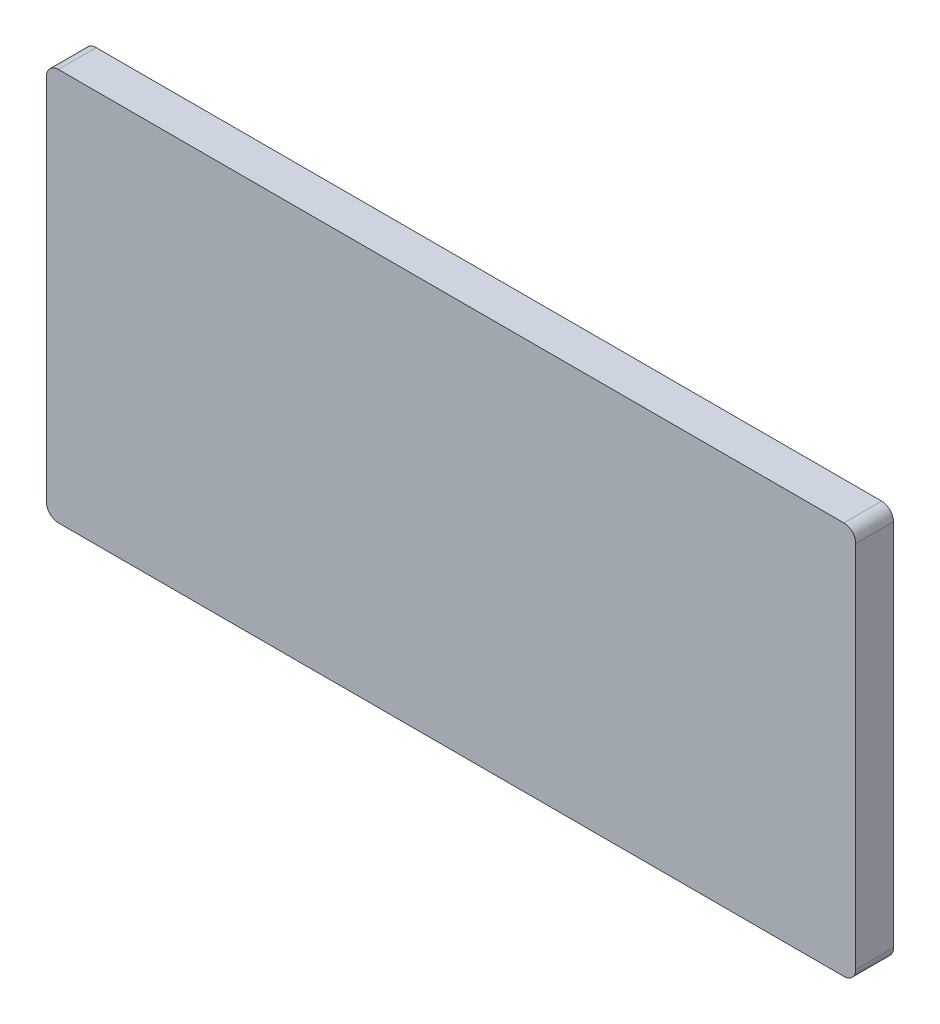
ISO-10303-21;
HEADER;
FILE_DESCRIPTION(('STEP AP214'),'2;1');
FILE_NAME('part.step','',(''),(''),'','','');
FILE_SCHEMA(('AUTOMOTIVE_DESIGN { 1 0 10303 214 1 1 1 1 }'));
ENDSEC;
DATA;
#1=APPLICATION_CONTEXT('core data for automotive mechanical design processes');
#2=APPLICATION_PROTOCOL_DEFINITION('international standard','automotive_design',2000,#1);
#3=PRODUCT_CONTEXT('',#1,'mechanical');
#4=PRODUCT('Part','Part','',(#3));
#5=PRODUCT_RELATED_PRODUCT_CATEGORY('part','',(#4));
#6=PRODUCT_DEFINITION_FORMATION('','',#4);
#7=PRODUCT_DEFINITION_CONTEXT('part definition',#1,'design');
#8=PRODUCT_DEFINITION('design','',#6,#7);
#9=PRODUCT_DEFINITION_SHAPE('','',#8);
#10=(LENGTH_UNIT() NAMED_UNIT(*) SI_UNIT(.MILLI.,.METRE.));
#11=(NAMED_UNIT(*) PLANE_ANGLE_UNIT() SI_UNIT($,.RADIAN.));
#12=(NAMED_UNIT(*) SI_UNIT($,.STERADIAN.) SOLID_ANGLE_UNIT());
#13=UNCERTAINTY_MEASURE_WITH_UNIT(LENGTH_MEASURE(1.E-05),#10,'distance_accuracy_value','');
#14=(GEOMETRIC_REPRESENTATION_CONTEXT(3) GLOBAL_UNCERTAINTY_ASSIGNED_CONTEXT((#13)) GLOBAL_UNIT_ASSIGNED_CONTEXT((#10,
#11,#12)) REPRESENTATION_CONTEXT('',''));
#15=CARTESIAN_POINT('',(0.,0.,0.));
#16=DIRECTION('',(0.,0.,1.));
#17=DIRECTION('',(1.,0.,0.));
#18=AXIS2_PLACEMENT_3D('',#15,#16,#17);
#19=CARTESIAN_POINT('',(0.,16.5,3.175));
#20=DIRECTION('',(0.,-1.,0.));
#21=DIRECTION('',(1.,0.,0.));
#22=AXIS2_PLACEMENT_3D('',#19,#20,#21);
#23=PLANE('',#22);
#24=DIRECTION('',(-1.,0.,0.));
#25=VECTOR('',#24,1.);
#26=CARTESIAN_POINT('',(0.,16.5,0.));
#27=LINE('',#26,#25);
#28=CARTESIAN_POINT('',(33.,16.5,0.));
#29=VERTEX_POINT('',#28);
#30=CARTESIAN_POINT('',(-33.,16.5,0.));
#31=VERTEX_POINT('',#30);
#32=EDGE_CURVE('E366',#29,#31,#27,.T.);
#33=ORIENTED_EDGE('',*,*,#32,.T.);
#34=DIRECTION('',(0.,0.,-1.));
#35=VECTOR('',#34,1.);
#36=CARTESIAN_POINT('',(-33.,16.5,3.175));
#37=LINE('',#36,#35);
#38=CARTESIAN_POINT('',(-33.,16.5,3.175));
#39=VERTEX_POINT('',#38);
#40=EDGE_CURVE('E11',#31,#39,#37,.F.);
#41=ORIENTED_EDGE('',*,*,#40,.T.);
#42=DIRECTION('',(-1.,0.,0.));
#43=VECTOR('',#42,1.);
#44=CARTESIAN_POINT('',(0.,16.5,3.175));
#45=LINE('',#44,#43);
#46=CARTESIAN_POINT('',(33.,16.5,3.175));
#47=VERTEX_POINT('',#46);
#48=EDGE_CURVE('E369',#47,#39,#45,.T.);
#49=ORIENTED_EDGE('',*,*,#48,.F.);
#50=DIRECTION('',(0.,0.,-1.));
#51=VECTOR('',#50,1.);
#52=CARTESIAN_POINT('',(33.,16.5,0.));
#53=LINE('',#52,#51);
#54=EDGE_CURVE('E52',#47,#29,#53,.T.);
#55=ORIENTED_EDGE('',*,*,#54,.T.);
#56=EDGE_LOOP('',(#33,#41,#49,#55));
#57=FACE_BOUND('',#56,.T.);
#58=ADVANCED_FACE('F44',(#57),#23,.F.);
#59=CARTESIAN_POINT('',(-34.,0.,3.175));
#60=DIRECTION('',(1.,0.,0.));
#61=DIRECTION('',(0.,0.,-1.));
#62=AXIS2_PLACEMENT_3D('',#59,#60,#61);
#63=PLANE('',#62);
#64=DIRECTION('',(0.,-1.,0.));
#65=VECTOR('',#64,1.);
#66=CARTESIAN_POINT('',(-34.,0.,0.));
#67=LINE('',#66,#65);
#68=CARTESIAN_POINT('',(-34.,15.5,0.));
#69=VERTEX_POINT('',#68);
#70=CARTESIAN_POINT('',(-34.,-15.5,0.));
#71=VERTEX_POINT('',#70);
#72=EDGE_CURVE('E389',#69,#71,#67,.T.);
#73=ORIENTED_EDGE('',*,*,#72,.T.);
#74=DIRECTION('',(0.,0.,-1.));
#75=VECTOR('',#74,1.);
#76=CARTESIAN_POINT('',(-34.,-15.5,3.175));
#77=LINE('',#76,#75);
#78=CARTESIAN_POINT('',(-34.,-15.5,3.175));
#79=VERTEX_POINT('',#78);
#80=EDGE_CURVE('E434',#71,#79,#77,.F.);
#81=ORIENTED_EDGE('',*,*,#80,.T.);
#82=DIRECTION('',(0.,-1.,0.));
#83=VECTOR('',#82,1.);
#84=CARTESIAN_POINT('',(-34.,0.,3.175));
#85=LINE('',#84,#83);
#86=CARTESIAN_POINT('',(-34.,15.5,3.175));
#87=VERTEX_POINT('',#86);
#88=EDGE_CURVE('E373',#87,#79,#85,.T.);
#89=ORIENTED_EDGE('',*,*,#88,.F.);
#90=DIRECTION('',(0.,0.,-1.));
#91=VECTOR('',#90,1.);
#92=CARTESIAN_POINT('',(-34.,15.5,3.175));
#93=LINE('',#92,#91);
#94=EDGE_CURVE('E431',#87,#69,#93,.T.);
#95=ORIENTED_EDGE('',*,*,#94,.T.);
#96=EDGE_LOOP('',(#73,#81,#89,#95));
#97=FACE_BOUND('',#96,.T.);
#98=ADVANCED_FACE('F454',(#97),#63,.F.);
#99=CARTESIAN_POINT('',(0.,-16.5,3.175));
#100=DIRECTION('',(0.,-1.,0.));
#101=DIRECTION('',(1.,0.,0.));
#102=AXIS2_PLACEMENT_3D('',#99,#100,#101);
#103=PLANE('',#102);
#104=DIRECTION('',(-1.,0.,0.));
#105=VECTOR('',#104,1.);
#106=CARTESIAN_POINT('',(0.,-16.5,0.));
#107=LINE('',#106,#105);
#108=CARTESIAN_POINT('',(33.,-16.5,0.));
#109=VERTEX_POINT('',#108);
#110=CARTESIAN_POINT('',(-33.,-16.5,0.));
#111=VERTEX_POINT('',#110);
#112=EDGE_CURVE('E392',#109,#111,#107,.T.);
#113=ORIENTED_EDGE('',*,*,#112,.F.);
#114=DIRECTION('',(0.,0.,-1.));
#115=VECTOR('',#114,1.);
#116=CARTESIAN_POINT('',(33.,-16.5,3.175));
#117=LINE('',#116,#115);
#118=CARTESIAN_POINT('',(33.,-16.5,3.175));
#119=VERTEX_POINT('',#118);
#120=EDGE_CURVE('E418',#109,#119,#117,.F.);
#121=ORIENTED_EDGE('',*,*,#120,.T.);
#122=DIRECTION('',(-1.,0.,0.));
#123=VECTOR('',#122,1.);
#124=CARTESIAN_POINT('',(0.,-16.5,3.175));
#125=LINE('',#124,#123);
#126=CARTESIAN_POINT('',(-33.,-16.5,3.175));
#127=VERTEX_POINT('',#126);
#128=EDGE_CURVE('E377',#119,#127,#125,.T.);
#129=ORIENTED_EDGE('',*,*,#128,.T.);
#130=DIRECTION('',(0.,0.,-1.));
#131=VECTOR('',#130,1.);
#132=CARTESIAN_POINT('',(-33.,-16.5,0.));
#133=LINE('',#132,#131);
#134=EDGE_CURVE('E415',#127,#111,#133,.T.);
#135=ORIENTED_EDGE('',*,*,#134,.T.);
#136=EDGE_LOOP('',(#113,#121,#129,#135));
#137=FACE_BOUND('',#136,.T.);
#138=ADVANCED_FACE('F465',(#137),#103,.T.);
#139=CARTESIAN_POINT('',(34.,0.,3.175));
#140=DIRECTION('',(1.,0.,0.));
#141=DIRECTION('',(0.,1.,0.));
#142=AXIS2_PLACEMENT_3D('',#139,#140,#141);
#143=PLANE('',#142);
#144=DIRECTION('',(0.,-1.,0.));
#145=VECTOR('',#144,1.);
#146=CARTESIAN_POINT('',(34.,0.,3.175));
#147=LINE('',#146,#145);
#148=CARTESIAN_POINT('',(34.,15.5,3.175));
#149=VERTEX_POINT('',#148);
#150=CARTESIAN_POINT('',(34.,-15.5,3.175));
#151=VERTEX_POINT('',#150);
#152=EDGE_CURVE('E381',#149,#151,#147,.T.);
#153=ORIENTED_EDGE('',*,*,#152,.T.);
#154=DIRECTION('',(0.,0.,-1.));
#155=VECTOR('',#154,1.);
#156=CARTESIAN_POINT('',(34.,-15.5,3.175));
#157=LINE('',#156,#155);
#158=CARTESIAN_POINT('',(34.,-15.5,0.));
#159=VERTEX_POINT('',#158);
#160=EDGE_CURVE('E401',#151,#159,#157,.T.);
#161=ORIENTED_EDGE('',*,*,#160,.T.);
#162=DIRECTION('',(0.,-1.,0.));
#163=VECTOR('',#162,1.);
#164=CARTESIAN_POINT('',(34.,0.,0.));
#165=LINE('',#164,#163);
#166=CARTESIAN_POINT('',(34.,15.5,0.));
#167=VERTEX_POINT('',#166);
#168=EDGE_CURVE('E374',#167,#159,#165,.T.);
#169=ORIENTED_EDGE('',*,*,#168,.F.);
#170=DIRECTION('',(0.,0.,-1.));
#171=VECTOR('',#170,1.);
#172=CARTESIAN_POINT('',(34.,15.5,3.175));
#173=LINE('',#172,#171);
#174=EDGE_CURVE('E385',#167,#149,#173,.F.);
#175=ORIENTED_EDGE('',*,*,#174,.T.);
#176=EDGE_LOOP('',(#153,#161,#169,#175));
#177=FACE_BOUND('',#176,.T.);
#178=ADVANCED_FACE('F472',(#177),#143,.T.);
#179=CARTESIAN_POINT('',(0.,0.,3.175));
#180=DIRECTION('',(0.,0.,1.));
#181=DIRECTION('',(1.,0.,0.));
#182=AXIS2_PLACEMENT_3D('',#179,#180,#181);
#183=PLANE('',#182);
#184=ORIENTED_EDGE('',*,*,#128,.F.);
#185=CARTESIAN_POINT('',(33.,-15.5,3.175));
#186=DIRECTION('',(0.,0.,1.));
#187=DIRECTION('',(1.,0.,0.));
#188=AXIS2_PLACEMENT_3D('',#185,#186,#187);
#189=CIRCLE('',#188,1.);
#190=EDGE_CURVE('E428',#119,#151,#189,.T.);
#191=ORIENTED_EDGE('',*,*,#190,.T.);
#192=ORIENTED_EDGE('',*,*,#152,.F.);
#193=CARTESIAN_POINT('',(33.,15.5,3.175));
#194=DIRECTION('',(0.,0.,1.));
#195=DIRECTION('',(1.,0.,0.));
#196=AXIS2_PLACEMENT_3D('',#193,#194,#195);
#197=CIRCLE('',#196,1.);
#198=EDGE_CURVE('E421',#149,#47,#197,.T.);
#199=ORIENTED_EDGE('',*,*,#198,.T.);
#200=ORIENTED_EDGE('',*,*,#48,.T.);
#201=CARTESIAN_POINT('',(-33.,15.5,3.175));
#202=DIRECTION('',(0.,0.,1.));
#203=DIRECTION('',(1.,0.,0.));
#204=AXIS2_PLACEMENT_3D('',#201,#202,#203);
#205=CIRCLE('',#204,1.);
#206=EDGE_CURVE('E424',#39,#87,#205,.T.);
#207=ORIENTED_EDGE('',*,*,#206,.T.);
#208=ORIENTED_EDGE('',*,*,#88,.T.);
#209=CARTESIAN_POINT('',(-33.,-15.5,3.175));
#210=DIRECTION('',(0.,0.,1.));
#211=DIRECTION('',(1.,0.,0.));
#212=AXIS2_PLACEMENT_3D('',#209,#210,#211);
#213=CIRCLE('',#212,1.);
#214=EDGE_CURVE('E426',#79,#127,#213,.T.);
#215=ORIENTED_EDGE('',*,*,#214,.T.);
#216=EDGE_LOOP('',(#184,#191,#192,#199,#200,#207,#208,#215));
#217=FACE_BOUND('',#216,.T.);
#218=ADVANCED_FACE('F459',(#217),#183,.T.);
#219=CARTESIAN_POINT('',(0.,0.,0.));
#220=DIRECTION('',(0.,0.,1.));
#221=DIRECTION('',(1.,0.,0.));
#222=AXIS2_PLACEMENT_3D('',#219,#220,#221);
#223=PLANE('',#222);
#224=CARTESIAN_POINT('',(-31.75,-14.25,0.));
#225=DIRECTION('',(0.,0.,-1.));
#226=DIRECTION('',(-1.,0.,0.));
#227=AXIS2_PLACEMENT_3D('',#224,#225,#226);
#228=CIRCLE('',#227,1.7);
#229=CARTESIAN_POINT('',(-33.45,-14.25,0.));
#230=VERTEX_POINT('',#229);
#231=EDGE_CURVE('E270',#230,#230,#228,.T.);
#232=ORIENTED_EDGE('',*,*,#231,.F.);
#233=EDGE_LOOP('',(#232));
#234=FACE_BOUND('',#233,.T.);
#235=CARTESIAN_POINT('',(-31.75,14.25,0.));
#236=DIRECTION('',(0.,0.,-1.));
#237=DIRECTION('',(1.,0.,0.));
#238=AXIS2_PLACEMENT_3D('',#235,#236,#237);
#239=CIRCLE('',#238,1.7);
#240=CARTESIAN_POINT('',(-30.05,14.25,0.));
#241=VERTEX_POINT('',#240);
#242=EDGE_CURVE('E276',#241,#241,#239,.T.);
#243=ORIENTED_EDGE('',*,*,#242,.F.);
#244=EDGE_LOOP('',(#243));
#245=FACE_BOUND('',#244,.T.);
#246=DIRECTION('',(-1.,0.,0.));
#247=VECTOR('',#246,1.);
#248=CARTESIAN_POINT('',(31.75,12.55,0.));
#249=LINE('',#248,#247);
#250=CARTESIAN_POINT('',(31.75,12.55,0.));
#251=VERTEX_POINT('',#250);
#252=CARTESIAN_POINT('',(29.25,12.55,0.));
#253=VERTEX_POINT('',#252);
#254=EDGE_CURVE('E300',#251,#253,#249,.T.);
#255=ORIENTED_EDGE('',*,*,#254,.F.);
#256=CARTESIAN_POINT('',(31.75,14.25,0.));
#257=DIRECTION('',(0.,0.,-1.));
#258=DIRECTION('',(-1.,0.,0.));
#259=AXIS2_PLACEMENT_3D('',#256,#257,#258);
#260=CIRCLE('',#259,1.69999999999999);
#261=CARTESIAN_POINT('',(31.75,15.95,0.));
#262=VERTEX_POINT('',#261);
#263=EDGE_CURVE('E62',#262,#251,#260,.T.);
#264=ORIENTED_EDGE('',*,*,#263,.F.);
#265=DIRECTION('',(1.,0.,0.));
#266=VECTOR('',#265,1.);
#267=CARTESIAN_POINT('',(31.75,15.95,0.));
#268=LINE('',#267,#266);
#269=CARTESIAN_POINT('',(29.25,15.95,0.));
#270=VERTEX_POINT('',#269);
#271=EDGE_CURVE('E285',#270,#262,#268,.T.);
#272=ORIENTED_EDGE('',*,*,#271,.F.);
#273=CARTESIAN_POINT('',(29.25,14.25,0.));
#274=DIRECTION('',(0.,0.,-1.));
#275=DIRECTION('',(-1.,0.,0.));
#276=AXIS2_PLACEMENT_3D('',#273,#274,#275);
#277=CIRCLE('',#276,1.69999999999999);
#278=EDGE_CURVE('E305',#253,#270,#277,.T.);
#279=ORIENTED_EDGE('',*,*,#278,.F.);
#280=EDGE_LOOP('',(#255,#264,#272,#279));
#281=FACE_BOUND('',#280,.T.);
#282=DIRECTION('',(-1.,0.,0.));
#283=VECTOR('',#282,1.);
#284=CARTESIAN_POINT('',(31.75,-15.95,0.));
#285=LINE('',#284,#283);
#286=CARTESIAN_POINT('',(31.75,-15.95,0.));
#287=VERTEX_POINT('',#286);
#288=CARTESIAN_POINT('',(29.25,-15.95,0.));
#289=VERTEX_POINT('',#288);
#290=EDGE_CURVE('E342',#287,#289,#285,.T.);
#291=ORIENTED_EDGE('',*,*,#290,.F.);
#292=CARTESIAN_POINT('',(31.75,-14.25,0.));
#293=DIRECTION('',(0.,0.,-1.));
#294=DIRECTION('',(1.,0.,0.));
#295=AXIS2_PLACEMENT_3D('',#292,#293,#294);
#296=CIRCLE('',#295,1.69999999999999);
#297=CARTESIAN_POINT('',(31.75,-12.55,0.));
#298=VERTEX_POINT('',#297);
#299=EDGE_CURVE('E73',#298,#287,#296,.T.);
#300=ORIENTED_EDGE('',*,*,#299,.F.);
#301=DIRECTION('',(1.,0.,0.));
#302=VECTOR('',#301,1.);
#303=CARTESIAN_POINT('',(31.75,-12.55,0.));
#304=LINE('',#303,#302);
#305=CARTESIAN_POINT('',(29.25,-12.55,0.));
#306=VERTEX_POINT('',#305);
#307=EDGE_CURVE('E327',#306,#298,#304,.T.);
#308=ORIENTED_EDGE('',*,*,#307,.F.);
#309=CARTESIAN_POINT('',(29.25,-14.25,0.));
#310=DIRECTION('',(0.,0.,-1.));
#311=DIRECTION('',(1.,0.,0.));
#312=AXIS2_PLACEMENT_3D('',#309,#310,#311);
#313=CIRCLE('',#312,1.69999999999999);
#314=EDGE_CURVE('E346',#289,#306,#313,.T.);
#315=ORIENTED_EDGE('',*,*,#314,.F.);
#316=EDGE_LOOP('',(#291,#300,#308,#315));
#317=FACE_BOUND('',#316,.T.);
#318=DIRECTION('',(-1.,0.,0.));
#319=VECTOR('',#318,1.);
#320=CARTESIAN_POINT('',(20.5,-2.15,0.));
#321=LINE('',#320,#319);
#322=CARTESIAN_POINT('',(20.5,-2.15,0.));
#323=VERTEX_POINT('',#322);
#324=CARTESIAN_POINT('',(17.5,-2.15,0.));
#325=VERTEX_POINT('',#324);
#326=EDGE_CURVE('E253',#323,#325,#321,.T.);
#327=ORIENTED_EDGE('',*,*,#326,.F.);
#328=CARTESIAN_POINT('',(20.5,0.,0.));
#329=DIRECTION('',(0.,0.,-1.));
#330=DIRECTION('',(-1.,0.,0.));
#331=AXIS2_PLACEMENT_3D('',#328,#329,#330);
#332=CIRCLE('',#331,2.15);
#333=CARTESIAN_POINT('',(20.5,2.15,0.));
#334=VERTEX_POINT('',#333);
#335=EDGE_CURVE('E219',#334,#323,#332,.T.);
#336=ORIENTED_EDGE('',*,*,#335,.F.);
#337=DIRECTION('',(1.,0.,0.));
#338=VECTOR('',#337,1.);
#339=CARTESIAN_POINT('',(20.5,2.15,0.));
#340=LINE('',#339,#338);
#341=CARTESIAN_POINT('',(17.5,2.15,0.));
#342=VERTEX_POINT('',#341);
#343=EDGE_CURVE('E239',#342,#334,#340,.T.);
#344=ORIENTED_EDGE('',*,*,#343,.F.);
#345=CARTESIAN_POINT('',(17.5,0.,0.));
#346=DIRECTION('',(0.,0.,-1.));
#347=DIRECTION('',(-1.,0.,0.));
#348=AXIS2_PLACEMENT_3D('',#345,#346,#347);
#349=CIRCLE('',#348,2.15);
#350=EDGE_CURVE('E245',#325,#342,#349,.T.);
#351=ORIENTED_EDGE('',*,*,#350,.F.);
#352=EDGE_LOOP('',(#327,#336,#344,#351));
#353=FACE_BOUND('',#352,.T.);
#354=CARTESIAN_POINT('',(-20.5,0.,0.));
#355=DIRECTION('',(0.,0.,-1.));
#356=DIRECTION('',(-1.,0.,0.));
#357=AXIS2_PLACEMENT_3D('',#354,#355,#356);
#358=CIRCLE('',#357,2.15);
#359=CARTESIAN_POINT('',(-22.65,0.,0.));
#360=VERTEX_POINT('',#359);
#361=EDGE_CURVE('E269',#360,#360,#358,.T.);
#362=ORIENTED_EDGE('',*,*,#361,.F.);
#363=EDGE_LOOP('',(#362));
#364=FACE_BOUND('',#363,.T.);
#365=ORIENTED_EDGE('',*,*,#168,.T.);
#366=CARTESIAN_POINT('',(33.,-15.5,0.));
#367=DIRECTION('',(0.,0.,1.));
#368=DIRECTION('',(1.,0.,0.));
#369=AXIS2_PLACEMENT_3D('',#366,#367,#368);
#370=CIRCLE('',#369,1.);
#371=EDGE_CURVE('E412',#159,#109,#370,.F.);
#372=ORIENTED_EDGE('',*,*,#371,.T.);
#373=ORIENTED_EDGE('',*,*,#112,.T.);
#374=CARTESIAN_POINT('',(-33.,-15.5,0.));
#375=DIRECTION('',(0.,0.,1.));
#376=DIRECTION('',(1.,0.,0.));
#377=AXIS2_PLACEMENT_3D('',#374,#375,#376);
#378=CIRCLE('',#377,1.);
#379=EDGE_CURVE('E410',#111,#71,#378,.F.);
#380=ORIENTED_EDGE('',*,*,#379,.T.);
#381=ORIENTED_EDGE('',*,*,#72,.F.);
#382=CARTESIAN_POINT('',(-33.,15.5,0.));
#383=DIRECTION('',(0.,0.,1.));
#384=DIRECTION('',(1.,0.,0.));
#385=AXIS2_PLACEMENT_3D('',#382,#383,#384);
#386=CIRCLE('',#385,1.);
#387=EDGE_CURVE('E408',#69,#31,#386,.F.);
#388=ORIENTED_EDGE('',*,*,#387,.T.);
#389=ORIENTED_EDGE('',*,*,#32,.F.);
#390=CARTESIAN_POINT('',(33.,15.5,0.));
#391=DIRECTION('',(0.,0.,1.));
#392=DIRECTION('',(1.,0.,0.));
#393=AXIS2_PLACEMENT_3D('',#390,#391,#392);
#394=CIRCLE('',#393,1.);
#395=EDGE_CURVE('E405',#29,#167,#394,.F.);
#396=ORIENTED_EDGE('',*,*,#395,.T.);
#397=EDGE_LOOP('',(#365,#372,#373,#380,#381,#388,#389,#396));
#398=FACE_BOUND('',#397,.T.);
#399=ADVANCED_FACE('F445',(#234,#245,#281,#317,#353,#364,#398),#223,.F.);
#400=CARTESIAN_POINT('',(33.,-15.5,3.175));
#401=DIRECTION('',(0.,0.,-1.));
#402=DIRECTION('',(-1.,0.,0.));
#403=AXIS2_PLACEMENT_3D('',#400,#401,#402);
#404=CYLINDRICAL_SURFACE('',#403,1.);
#405=ORIENTED_EDGE('',*,*,#190,.F.);
#406=ORIENTED_EDGE('',*,*,#120,.F.);
#407=ORIENTED_EDGE('',*,*,#371,.F.);
#408=ORIENTED_EDGE('',*,*,#160,.F.);
#409=EDGE_LOOP('',(#405,#406,#407,#408));
#410=FACE_BOUND('',#409,.T.);
#411=ADVANCED_FACE('F470',(#410),#404,.T.);
#412=CARTESIAN_POINT('',(-33.,-15.5,3.175));
#413=DIRECTION('',(0.,0.,1.));
#414=DIRECTION('',(1.,0.,0.));
#415=AXIS2_PLACEMENT_3D('',#412,#413,#414);
#416=CYLINDRICAL_SURFACE('',#415,1.);
#417=ORIENTED_EDGE('',*,*,#214,.F.);
#418=ORIENTED_EDGE('',*,*,#80,.F.);
#419=ORIENTED_EDGE('',*,*,#379,.F.);
#420=ORIENTED_EDGE('',*,*,#134,.F.);
#421=EDGE_LOOP('',(#417,#418,#419,#420));
#422=FACE_BOUND('',#421,.T.);
#423=ADVANCED_FACE('F462',(#422),#416,.T.);
#424=CARTESIAN_POINT('',(-33.,15.5,3.175));
#425=DIRECTION('',(0.,0.,-1.));
#426=DIRECTION('',(-1.,0.,0.));
#427=AXIS2_PLACEMENT_3D('',#424,#425,#426);
#428=CYLINDRICAL_SURFACE('',#427,1.);
#429=ORIENTED_EDGE('',*,*,#206,.F.);
#430=ORIENTED_EDGE('',*,*,#40,.F.);
#431=ORIENTED_EDGE('',*,*,#387,.F.);
#432=ORIENTED_EDGE('',*,*,#94,.F.);
#433=EDGE_LOOP('',(#429,#430,#431,#432));
#434=FACE_BOUND('',#433,.T.);
#435=ADVANCED_FACE('F451',(#434),#428,.T.);
#436=CARTESIAN_POINT('',(33.,15.5,3.175));
#437=DIRECTION('',(0.,0.,1.));
#438=DIRECTION('',(1.,0.,0.));
#439=AXIS2_PLACEMENT_3D('',#436,#437,#438);
#440=CYLINDRICAL_SURFACE('',#439,1.);
#441=ORIENTED_EDGE('',*,*,#198,.F.);
#442=ORIENTED_EDGE('',*,*,#174,.F.);
#443=ORIENTED_EDGE('',*,*,#395,.F.);
#444=ORIENTED_EDGE('',*,*,#54,.F.);
#445=EDGE_LOOP('',(#441,#442,#443,#444));
#446=FACE_BOUND('',#445,.T.);
#447=ADVANCED_FACE('F46',(#446),#440,.T.);
#448=CARTESIAN_POINT('',(-20.5,0.,1.25));
#449=DIRECTION('',(0.,0.,-1.));
#450=DIRECTION('',(-1.,0.,0.));
#451=AXIS2_PLACEMENT_3D('',#448,#449,#450);
#452=CYLINDRICAL_SURFACE('',#451,2.15);
#453=CARTESIAN_POINT('',(-20.5,0.,1.25));
#454=DIRECTION('',(0.,0.,-1.));
#455=DIRECTION('',(-1.,0.,0.));
#456=AXIS2_PLACEMENT_3D('',#453,#454,#455);
#457=CIRCLE('',#456,2.15);
#458=CARTESIAN_POINT('',(-22.65,0.,1.25));
#459=VERTEX_POINT('',#458);
#460=EDGE_CURVE('E363',#459,#459,#457,.T.);
#461=ORIENTED_EDGE('',*,*,#460,.F.);
#462=EDGE_LOOP('',(#461));
#463=FACE_BOUND('',#462,.T.);
#464=ORIENTED_EDGE('',*,*,#361,.T.);
#465=EDGE_LOOP('',(#464));
#466=FACE_BOUND('',#465,.T.);
#467=ADVANCED_FACE('F476',(#463,#466),#452,.F.);
#468=CARTESIAN_POINT('',(-20.5,0.,1.25));
#469=DIRECTION('',(0.,0.,-1.));
#470=DIRECTION('',(-1.,0.,0.));
#471=AXIS2_PLACEMENT_3D('',#468,#469,#470);
#472=PLANE('',#471);
#473=ORIENTED_EDGE('',*,*,#460,.T.);
#474=EDGE_LOOP('',(#473));
#475=FACE_BOUND('',#474,.T.);
#476=ADVANCED_FACE('F481',(#475),#472,.T.);
#477=CARTESIAN_POINT('',(20.5,0.,1.25));
#478=DIRECTION('',(0.,0.,-1.));
#479=DIRECTION('',(-1.,0.,0.));
#480=AXIS2_PLACEMENT_3D('',#477,#478,#479);
#481=CYLINDRICAL_SURFACE('',#480,2.15);
#482=ORIENTED_EDGE('',*,*,#335,.T.);
#483=DIRECTION('',(0.,0.,-1.));
#484=VECTOR('',#483,1.);
#485=CARTESIAN_POINT('',(20.5,-2.15,1.25));
#486=LINE('',#485,#484);
#487=CARTESIAN_POINT('',(20.5,-2.15,1.25));
#488=VERTEX_POINT('',#487);
#489=EDGE_CURVE('E212',#488,#323,#486,.T.);
#490=ORIENTED_EDGE('',*,*,#489,.F.);
#491=CARTESIAN_POINT('',(20.5,0.,1.25));
#492=DIRECTION('',(0.,0.,-1.));
#493=DIRECTION('',(-1.,0.,0.));
#494=AXIS2_PLACEMENT_3D('',#491,#492,#493);
#495=CIRCLE('',#494,2.15);
#496=CARTESIAN_POINT('',(20.5,2.15,1.25));
#497=VERTEX_POINT('',#496);
#498=EDGE_CURVE('E216',#497,#488,#495,.T.);
#499=ORIENTED_EDGE('',*,*,#498,.F.);
#500=DIRECTION('',(0.,0.,-1.));
#501=VECTOR('',#500,1.);
#502=CARTESIAN_POINT('',(20.5,2.15,1.25));
#503=LINE('',#502,#501);
#504=EDGE_CURVE('E258',#497,#334,#503,.T.);
#505=ORIENTED_EDGE('',*,*,#504,.T.);
#506=EDGE_LOOP('',(#482,#490,#499,#505));
#507=FACE_BOUND('',#506,.T.);
#508=ADVANCED_FACE('F214',(#507),#481,.F.);
#509=CARTESIAN_POINT('',(20.5,2.15,1.25));
#510=DIRECTION('',(0.,1.,0.));
#511=DIRECTION('',(0.,0.,1.));
#512=AXIS2_PLACEMENT_3D('',#509,#510,#511);
#513=PLANE('',#512);
#514=ORIENTED_EDGE('',*,*,#343,.T.);
#515=ORIENTED_EDGE('',*,*,#504,.F.);
#516=DIRECTION('',(1.,0.,0.));
#517=VECTOR('',#516,1.);
#518=CARTESIAN_POINT('',(20.5,2.15,1.25));
#519=LINE('',#518,#517);
#520=CARTESIAN_POINT('',(17.5,2.15,1.25));
#521=VERTEX_POINT('',#520);
#522=EDGE_CURVE('E225',#521,#497,#519,.T.);
#523=ORIENTED_EDGE('',*,*,#522,.F.);
#524=DIRECTION('',(0.,0.,-1.));
#525=VECTOR('',#524,1.);
#526=CARTESIAN_POINT('',(17.5,2.15,1.25));
#527=LINE('',#526,#525);
#528=EDGE_CURVE('E261',#521,#342,#527,.T.);
#529=ORIENTED_EDGE('',*,*,#528,.T.);
#530=EDGE_LOOP('',(#514,#515,#523,#529));
#531=FACE_BOUND('',#530,.T.);
#532=ADVANCED_FACE('F543',(#531),#513,.F.);
#533=CARTESIAN_POINT('',(17.5,0.,1.25));
#534=DIRECTION('',(0.,0.,-1.));
#535=DIRECTION('',(-1.,0.,0.));
#536=AXIS2_PLACEMENT_3D('',#533,#534,#535);
#537=CYLINDRICAL_SURFACE('',#536,2.15);
#538=ORIENTED_EDGE('',*,*,#350,.T.);
#539=ORIENTED_EDGE('',*,*,#528,.F.);
#540=CARTESIAN_POINT('',(17.5,0.,1.25));
#541=DIRECTION('',(0.,0.,-1.));
#542=DIRECTION('',(-1.,0.,0.));
#543=AXIS2_PLACEMENT_3D('',#540,#541,#542);
#544=CIRCLE('',#543,2.15);
#545=CARTESIAN_POINT('',(17.5,-2.15,1.25));
#546=VERTEX_POINT('',#545);
#547=EDGE_CURVE('E234',#546,#521,#544,.T.);
#548=ORIENTED_EDGE('',*,*,#547,.F.);
#549=DIRECTION('',(0.,0.,-1.));
#550=VECTOR('',#549,1.);
#551=CARTESIAN_POINT('',(17.5,-2.15,1.25));
#552=LINE('',#551,#550);
#553=EDGE_CURVE('E224',#546,#325,#552,.T.);
#554=ORIENTED_EDGE('',*,*,#553,.T.);
#555=EDGE_LOOP('',(#538,#539,#548,#554));
#556=FACE_BOUND('',#555,.T.);
#557=ADVANCED_FACE('F552',(#556),#537,.F.);
#558=CARTESIAN_POINT('',(20.5,-2.15,1.25));
#559=DIRECTION('',(0.,-1.,0.));
#560=DIRECTION('',(0.,0.,-1.));
#561=AXIS2_PLACEMENT_3D('',#558,#559,#560);
#562=PLANE('',#561);
#563=ORIENTED_EDGE('',*,*,#326,.T.);
#564=ORIENTED_EDGE('',*,*,#553,.F.);
#565=DIRECTION('',(-1.,0.,0.));
#566=VECTOR('',#565,1.);
#567=CARTESIAN_POINT('',(20.5,-2.15,1.25));
#568=LINE('',#567,#566);
#569=EDGE_CURVE('E228',#488,#546,#568,.T.);
#570=ORIENTED_EDGE('',*,*,#569,.F.);
#571=ORIENTED_EDGE('',*,*,#489,.T.);
#572=EDGE_LOOP('',(#563,#564,#570,#571));
#573=FACE_BOUND('',#572,.T.);
#574=ADVANCED_FACE('F229',(#573),#562,.F.);
#575=CARTESIAN_POINT('',(20.5,0.,1.25));
#576=DIRECTION('',(0.,0.,-1.));
#577=DIRECTION('',(-1.,0.,0.));
#578=AXIS2_PLACEMENT_3D('',#575,#576,#577);
#579=PLANE('',#578);
#580=ORIENTED_EDGE('',*,*,#498,.T.);
#581=ORIENTED_EDGE('',*,*,#569,.T.);
#582=ORIENTED_EDGE('',*,*,#547,.T.);
#583=ORIENTED_EDGE('',*,*,#522,.T.);
#584=EDGE_LOOP('',(#580,#581,#582,#583));
#585=FACE_BOUND('',#584,.T.);
#586=ADVANCED_FACE('F236',(#585),#579,.T.);
#587=CARTESIAN_POINT('',(31.75,-14.25,1.25));
#588=DIRECTION('',(0.,0.,-1.));
#589=DIRECTION('',(-1.,0.,0.));
#590=AXIS2_PLACEMENT_3D('',#587,#588,#589);
#591=CYLINDRICAL_SURFACE('',#590,1.69999999999999);
#592=ORIENTED_EDGE('',*,*,#299,.T.);
#593=DIRECTION('',(0.,0.,-1.));
#594=VECTOR('',#593,1.);
#595=CARTESIAN_POINT('',(31.75,-15.95,1.25));
#596=LINE('',#595,#594);
#597=CARTESIAN_POINT('',(31.75,-15.95,1.25));
#598=VERTEX_POINT('',#597);
#599=EDGE_CURVE('E339',#598,#287,#596,.T.);
#600=ORIENTED_EDGE('',*,*,#599,.F.);
#601=CARTESIAN_POINT('',(31.75,-14.25,1.25));
#602=DIRECTION('',(0.,0.,-1.));
#603=DIRECTION('',(1.,0.,0.));
#604=AXIS2_PLACEMENT_3D('',#601,#602,#603);
#605=CIRCLE('',#604,1.69999999999999);
#606=CARTESIAN_POINT('',(31.75,-12.55,1.25));
#607=VERTEX_POINT('',#606);
#608=EDGE_CURVE('E322',#607,#598,#605,.T.);
#609=ORIENTED_EDGE('',*,*,#608,.F.);
#610=DIRECTION('',(0.,0.,-1.));
#611=VECTOR('',#610,1.);
#612=CARTESIAN_POINT('',(31.75,-12.55,1.25));
#613=LINE('',#612,#611);
#614=EDGE_CURVE('E301',#607,#298,#613,.T.);
#615=ORIENTED_EDGE('',*,*,#614,.T.);
#616=EDGE_LOOP('',(#592,#600,#609,#615));
#617=FACE_BOUND('',#616,.T.);
#618=ADVANCED_FACE('F579',(#617),#591,.F.);
#619=CARTESIAN_POINT('',(31.75,-12.55,1.25));
#620=DIRECTION('',(0.,1.,0.));
#621=DIRECTION('',(-1.,0.,0.));
#622=AXIS2_PLACEMENT_3D('',#619,#620,#621);
#623=PLANE('',#622);
#624=ORIENTED_EDGE('',*,*,#307,.T.);
#625=ORIENTED_EDGE('',*,*,#614,.F.);
#626=DIRECTION('',(1.,0.,0.));
#627=VECTOR('',#626,1.);
#628=CARTESIAN_POINT('',(31.75,-12.55,1.25));
#629=LINE('',#628,#627);
#630=CARTESIAN_POINT('',(29.25,-12.55,1.25));
#631=VERTEX_POINT('',#630);
#632=EDGE_CURVE('E335',#631,#607,#629,.T.);
#633=ORIENTED_EDGE('',*,*,#632,.F.);
#634=DIRECTION('',(0.,0.,-1.));
#635=VECTOR('',#634,1.);
#636=CARTESIAN_POINT('',(29.25,-12.55,1.25));
#637=LINE('',#636,#635);
#638=EDGE_CURVE('E355',#631,#306,#637,.T.);
#639=ORIENTED_EDGE('',*,*,#638,.T.);
#640=EDGE_LOOP('',(#624,#625,#633,#639));
#641=FACE_BOUND('',#640,.T.);
#642=ADVANCED_FACE('F588',(#641),#623,.F.);
#643=CARTESIAN_POINT('',(29.25,-14.25,1.25));
#644=DIRECTION('',(0.,0.,-1.));
#645=DIRECTION('',(-1.,0.,0.));
#646=AXIS2_PLACEMENT_3D('',#643,#644,#645);
#647=CYLINDRICAL_SURFACE('',#646,1.69999999999999);
#648=ORIENTED_EDGE('',*,*,#314,.T.);
#649=ORIENTED_EDGE('',*,*,#638,.F.);
#650=CARTESIAN_POINT('',(29.25,-14.25,1.25));
#651=DIRECTION('',(0.,0.,-1.));
#652=DIRECTION('',(1.,0.,0.));
#653=AXIS2_PLACEMENT_3D('',#650,#651,#652);
#654=CIRCLE('',#653,1.69999999999999);
#655=CARTESIAN_POINT('',(29.25,-15.95,1.25));
#656=VERTEX_POINT('',#655);
#657=EDGE_CURVE('E331',#656,#631,#654,.T.);
#658=ORIENTED_EDGE('',*,*,#657,.F.);
#659=DIRECTION('',(0.,0.,-1.));
#660=VECTOR('',#659,1.);
#661=CARTESIAN_POINT('',(29.25,-15.95,1.25));
#662=LINE('',#661,#660);
#663=EDGE_CURVE('E358',#656,#289,#662,.T.);
#664=ORIENTED_EDGE('',*,*,#663,.T.);
#665=EDGE_LOOP('',(#648,#649,#658,#664));
#666=FACE_BOUND('',#665,.T.);
#667=ADVANCED_FACE('F597',(#666),#647,.F.);
#668=CARTESIAN_POINT('',(31.75,-15.95,1.25));
#669=DIRECTION('',(0.,-1.,0.));
#670=DIRECTION('',(1.,0.,0.));
#671=AXIS2_PLACEMENT_3D('',#668,#669,#670);
#672=PLANE('',#671);
#673=ORIENTED_EDGE('',*,*,#290,.T.);
#674=ORIENTED_EDGE('',*,*,#663,.F.);
#675=DIRECTION('',(-1.,0.,0.));
#676=VECTOR('',#675,1.);
#677=CARTESIAN_POINT('',(31.75,-15.95,1.25));
#678=LINE('',#677,#676);
#679=EDGE_CURVE('E326',#598,#656,#678,.T.);
#680=ORIENTED_EDGE('',*,*,#679,.F.);
#681=ORIENTED_EDGE('',*,*,#599,.T.);
#682=EDGE_LOOP('',(#673,#674,#680,#681));
#683=FACE_BOUND('',#682,.T.);
#684=ADVANCED_FACE('F607',(#683),#672,.F.);
#685=CARTESIAN_POINT('',(31.75,-14.25,1.25));
#686=DIRECTION('',(0.,0.,1.));
#687=DIRECTION('',(1.,0.,0.));
#688=AXIS2_PLACEMENT_3D('',#685,#686,#687);
#689=PLANE('',#688);
#690=ORIENTED_EDGE('',*,*,#608,.T.);
#691=ORIENTED_EDGE('',*,*,#679,.T.);
#692=ORIENTED_EDGE('',*,*,#657,.T.);
#693=ORIENTED_EDGE('',*,*,#632,.T.);
#694=EDGE_LOOP('',(#690,#691,#692,#693));
#695=FACE_BOUND('',#694,.T.);
#696=ADVANCED_FACE('F617',(#695),#689,.F.);
#697=CARTESIAN_POINT('',(31.75,14.25,1.25));
#698=DIRECTION('',(0.,0.,-1.));
#699=DIRECTION('',(-1.,0.,0.));
#700=AXIS2_PLACEMENT_3D('',#697,#698,#699);
#701=CYLINDRICAL_SURFACE('',#700,1.69999999999999);
#702=ORIENTED_EDGE('',*,*,#263,.T.);
#703=DIRECTION('',(0.,0.,-1.));
#704=VECTOR('',#703,1.);
#705=CARTESIAN_POINT('',(31.75,12.55,1.25));
#706=LINE('',#705,#704);
#707=CARTESIAN_POINT('',(31.75,12.55,1.25));
#708=VERTEX_POINT('',#707);
#709=EDGE_CURVE('E297',#708,#251,#706,.T.);
#710=ORIENTED_EDGE('',*,*,#709,.F.);
#711=CARTESIAN_POINT('',(31.75,14.25,1.25));
#712=DIRECTION('',(0.,0.,-1.));
#713=DIRECTION('',(-1.,0.,0.));
#714=AXIS2_PLACEMENT_3D('',#711,#712,#713);
#715=CIRCLE('',#714,1.69999999999999);
#716=CARTESIAN_POINT('',(31.75,15.95,1.25));
#717=VERTEX_POINT('',#716);
#718=EDGE_CURVE('E280',#717,#708,#715,.T.);
#719=ORIENTED_EDGE('',*,*,#718,.F.);
#720=DIRECTION('',(0.,0.,-1.));
#721=VECTOR('',#720,1.);
#722=CARTESIAN_POINT('',(31.75,15.95,1.25));
#723=LINE('',#722,#721);
#724=EDGE_CURVE('E279',#717,#262,#723,.T.);
#725=ORIENTED_EDGE('',*,*,#724,.T.);
#726=EDGE_LOOP('',(#702,#710,#719,#725));
#727=FACE_BOUND('',#726,.T.);
#728=ADVANCED_FACE('F627',(#727),#701,.F.);
#729=CARTESIAN_POINT('',(31.75,15.95,1.25));
#730=DIRECTION('',(0.,1.,0.));
#731=DIRECTION('',(-1.,0.,0.));
#732=AXIS2_PLACEMENT_3D('',#729,#730,#731);
#733=PLANE('',#732);
#734=ORIENTED_EDGE('',*,*,#271,.T.);
#735=ORIENTED_EDGE('',*,*,#724,.F.);
#736=DIRECTION('',(1.,0.,0.));
#737=VECTOR('',#736,1.);
#738=CARTESIAN_POINT('',(31.75,15.95,1.25));
#739=LINE('',#738,#737);
#740=CARTESIAN_POINT('',(29.25,15.95,1.25));
#741=VERTEX_POINT('',#740);
#742=EDGE_CURVE('E293',#741,#717,#739,.T.);
#743=ORIENTED_EDGE('',*,*,#742,.F.);
#744=DIRECTION('',(0.,0.,-1.));
#745=VECTOR('',#744,1.);
#746=CARTESIAN_POINT('',(29.25,15.95,1.25));
#747=LINE('',#746,#745);
#748=EDGE_CURVE('E314',#741,#270,#747,.T.);
#749=ORIENTED_EDGE('',*,*,#748,.T.);
#750=EDGE_LOOP('',(#734,#735,#743,#749));
#751=FACE_BOUND('',#750,.T.);
#752=ADVANCED_FACE('F637',(#751),#733,.F.);
#753=CARTESIAN_POINT('',(29.25,14.25,1.25));
#754=DIRECTION('',(0.,0.,-1.));
#755=DIRECTION('',(-1.,0.,0.));
#756=AXIS2_PLACEMENT_3D('',#753,#754,#755);
#757=CYLINDRICAL_SURFACE('',#756,1.69999999999999);
#758=ORIENTED_EDGE('',*,*,#278,.T.);
#759=ORIENTED_EDGE('',*,*,#748,.F.);
#760=CARTESIAN_POINT('',(29.25,14.25,1.25));
#761=DIRECTION('',(0.,0.,-1.));
#762=DIRECTION('',(-1.,0.,0.));
#763=AXIS2_PLACEMENT_3D('',#760,#761,#762);
#764=CIRCLE('',#763,1.69999999999999);
#765=CARTESIAN_POINT('',(29.25,12.55,1.25));
#766=VERTEX_POINT('',#765);
#767=EDGE_CURVE('E289',#766,#741,#764,.T.);
#768=ORIENTED_EDGE('',*,*,#767,.F.);
#769=DIRECTION('',(0.,0.,-1.));
#770=VECTOR('',#769,1.);
#771=CARTESIAN_POINT('',(29.25,12.55,1.25));
#772=LINE('',#771,#770);
#773=EDGE_CURVE('E317',#766,#253,#772,.T.);
#774=ORIENTED_EDGE('',*,*,#773,.T.);
#775=EDGE_LOOP('',(#758,#759,#768,#774));
#776=FACE_BOUND('',#775,.T.);
#777=ADVANCED_FACE('F646',(#776),#757,.F.);
#778=CARTESIAN_POINT('',(31.75,12.55,1.25));
#779=DIRECTION('',(0.,-1.,0.));
#780=DIRECTION('',(1.,0.,0.));
#781=AXIS2_PLACEMENT_3D('',#778,#779,#780);
#782=PLANE('',#781);
#783=ORIENTED_EDGE('',*,*,#254,.T.);
#784=ORIENTED_EDGE('',*,*,#773,.F.);
#785=DIRECTION('',(-1.,0.,0.));
#786=VECTOR('',#785,1.);
#787=CARTESIAN_POINT('',(31.75,12.55,1.25));
#788=LINE('',#787,#786);
#789=EDGE_CURVE('E284',#708,#766,#788,.T.);
#790=ORIENTED_EDGE('',*,*,#789,.F.);
#791=ORIENTED_EDGE('',*,*,#709,.T.);
#792=EDGE_LOOP('',(#783,#784,#790,#791));
#793=FACE_BOUND('',#792,.T.);
#794=ADVANCED_FACE('F656',(#793),#782,.F.);
#795=CARTESIAN_POINT('',(31.75,14.25,1.25));
#796=DIRECTION('',(0.,0.,-1.));
#797=DIRECTION('',(-1.,0.,0.));
#798=AXIS2_PLACEMENT_3D('',#795,#796,#797);
#799=PLANE('',#798);
#800=ORIENTED_EDGE('',*,*,#718,.T.);
#801=ORIENTED_EDGE('',*,*,#789,.T.);
#802=ORIENTED_EDGE('',*,*,#767,.T.);
#803=ORIENTED_EDGE('',*,*,#742,.T.);
#804=EDGE_LOOP('',(#800,#801,#802,#803));
#805=FACE_BOUND('',#804,.T.);
#806=ADVANCED_FACE('F666',(#805),#799,.T.);
#807=CARTESIAN_POINT('',(-31.75,14.25,1.25));
#808=DIRECTION('',(0.,0.,-1.));
#809=DIRECTION('',(-1.,0.,0.));
#810=AXIS2_PLACEMENT_3D('',#807,#808,#809);
#811=CYLINDRICAL_SURFACE('',#810,1.7);
#812=CARTESIAN_POINT('',(-31.75,14.25,1.25));
#813=DIRECTION('',(0.,0.,-1.));
#814=DIRECTION('',(1.,0.,0.));
#815=AXIS2_PLACEMENT_3D('',#812,#813,#814);
#816=CIRCLE('',#815,1.7);
#817=CARTESIAN_POINT('',(-30.05,14.25,1.25));
#818=VERTEX_POINT('',#817);
#819=EDGE_CURVE('E273',#818,#818,#816,.T.);
#820=ORIENTED_EDGE('',*,*,#819,.F.);
#821=EDGE_LOOP('',(#820));
#822=FACE_BOUND('',#821,.T.);
#823=ORIENTED_EDGE('',*,*,#242,.T.);
#824=EDGE_LOOP('',(#823));
#825=FACE_BOUND('',#824,.T.);
#826=ADVANCED_FACE('F676',(#822,#825),#811,.F.);
#827=CARTESIAN_POINT('',(-31.75,14.25,1.25));
#828=DIRECTION('',(0.,0.,1.));
#829=DIRECTION('',(1.,0.,0.));
#830=AXIS2_PLACEMENT_3D('',#827,#828,#829);
#831=PLANE('',#830);
#832=ORIENTED_EDGE('',*,*,#819,.T.);
#833=EDGE_LOOP('',(#832));
#834=FACE_BOUND('',#833,.T.);
#835=ADVANCED_FACE('F686',(#834),#831,.F.);
#836=CARTESIAN_POINT('',(-31.75,-14.25,1.25));
#837=DIRECTION('',(0.,0.,-1.));
#838=DIRECTION('',(-1.,0.,0.));
#839=AXIS2_PLACEMENT_3D('',#836,#837,#838);
#840=CYLINDRICAL_SURFACE('',#839,1.7);
#841=CARTESIAN_POINT('',(-31.75,-14.25,1.25));
#842=DIRECTION('',(0.,0.,-1.));
#843=DIRECTION('',(-1.,0.,0.));
#844=AXIS2_PLACEMENT_3D('',#841,#842,#843);
#845=CIRCLE('',#844,1.7);
#846=CARTESIAN_POINT('',(-33.45,-14.25,1.25));
#847=VERTEX_POINT('',#846);
#848=EDGE_CURVE('E266',#847,#847,#845,.T.);
#849=ORIENTED_EDGE('',*,*,#848,.F.);
#850=EDGE_LOOP('',(#849));
#851=FACE_BOUND('',#850,.T.);
#852=ORIENTED_EDGE('',*,*,#231,.T.);
#853=EDGE_LOOP('',(#852));
#854=FACE_BOUND('',#853,.T.);
#855=ADVANCED_FACE('F696',(#851,#854),#840,.F.);
#856=CARTESIAN_POINT('',(-31.75,-14.25,1.25));
#857=DIRECTION('',(0.,0.,-1.));
#858=DIRECTION('',(-1.,0.,0.));
#859=AXIS2_PLACEMENT_3D('',#856,#857,#858);
#860=PLANE('',#859);
#861=ORIENTED_EDGE('',*,*,#848,.T.);
#862=EDGE_LOOP('',(#861));
#863=FACE_BOUND('',#862,.T.);
#864=ADVANCED_FACE('F706',(#863),#860,.T.);
#865=CLOSED_SHELL('',(#58,#98,#138,#178,#218,#399,#411,#423,#435,#447,#467,#476,#508,#532,#557,
#574,#586,#618,#642,#667,#684,#696,#728,#752,#777,#794,#806,#826,#835,#855,#864));
#866=MANIFOLD_SOLID_BREP('B2',#865);
#867=ADVANCED_BREP_SHAPE_REPRESENTATION('',(#18,#866),#14);
#868=SHAPE_DEFINITION_REPRESENTATION(#9,#867);
ENDSEC;
END-ISO-10303-21;
